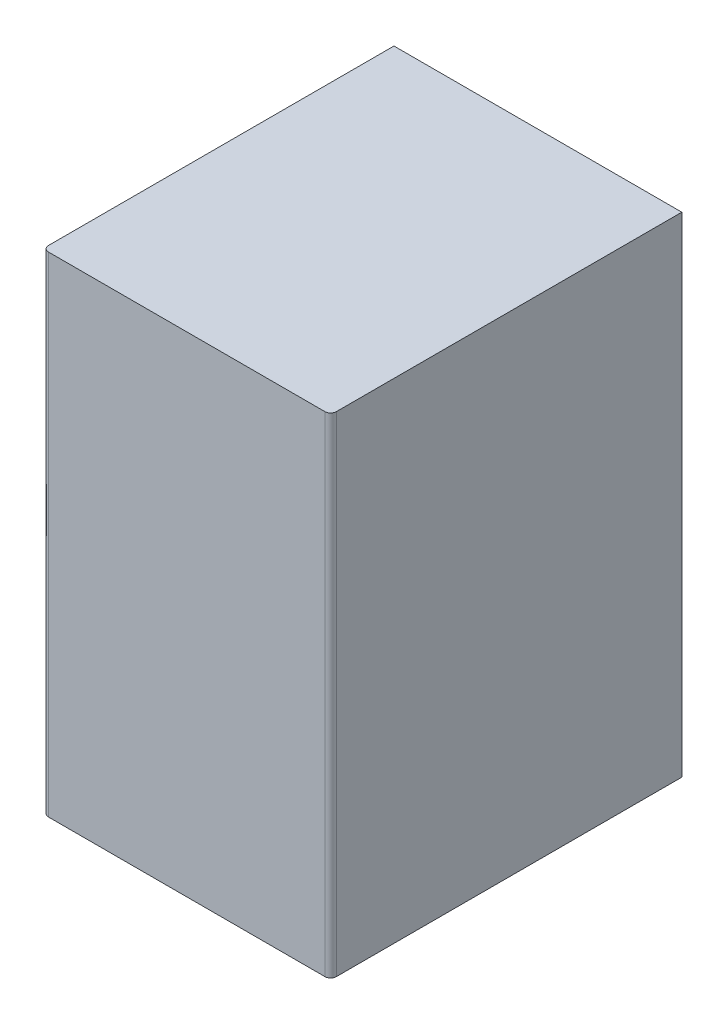
ISO-10303-21;
HEADER;
FILE_DESCRIPTION(('STEP AP214'),'2;1');
FILE_NAME('part.step','',(''),(''),'','','');
FILE_SCHEMA(('AUTOMOTIVE_DESIGN { 1 0 10303 214 1 1 1 1 }'));
ENDSEC;
DATA;
#1=APPLICATION_CONTEXT('core data for automotive mechanical design processes');
#2=APPLICATION_PROTOCOL_DEFINITION('international standard','automotive_design',2000,#1);
#3=PRODUCT_CONTEXT('',#1,'mechanical');
#4=PRODUCT('Part','Part','',(#3));
#5=PRODUCT_RELATED_PRODUCT_CATEGORY('part','',(#4));
#6=PRODUCT_DEFINITION_FORMATION('','',#4);
#7=PRODUCT_DEFINITION_CONTEXT('part definition',#1,'design');
#8=PRODUCT_DEFINITION('design','',#6,#7);
#9=PRODUCT_DEFINITION_SHAPE('','',#8);
#10=(LENGTH_UNIT() NAMED_UNIT(*) SI_UNIT(.MILLI.,.METRE.));
#11=(NAMED_UNIT(*) PLANE_ANGLE_UNIT() SI_UNIT($,.RADIAN.));
#12=(NAMED_UNIT(*) SI_UNIT($,.STERADIAN.) SOLID_ANGLE_UNIT());
#13=UNCERTAINTY_MEASURE_WITH_UNIT(LENGTH_MEASURE(1.E-05),#10,'distance_accuracy_value','');
#14=(GEOMETRIC_REPRESENTATION_CONTEXT(3) GLOBAL_UNCERTAINTY_ASSIGNED_CONTEXT((#13)) GLOBAL_UNIT_ASSIGNED_CONTEXT((#10,
#11,#12)) REPRESENTATION_CONTEXT('',''));
#15=CARTESIAN_POINT('',(0.,0.,0.));
#16=DIRECTION('',(0.,0.,1.));
#17=DIRECTION('',(1.,0.,0.));
#18=AXIS2_PLACEMENT_3D('',#15,#16,#17);
#19=CARTESIAN_POINT('',(250.,850.,-305.));
#20=DIRECTION('',(-1.,0.,0.));
#21=DIRECTION('',(0.,0.,1.));
#22=AXIS2_PLACEMENT_3D('',#19,#20,#21);
#23=PLANE('',#22);
#24=DIRECTION('',(0.,0.,-1.));
#25=VECTOR('',#24,1.);
#26=CARTESIAN_POINT('',(250.,850.,-305.));
#27=LINE('',#26,#25);
#28=CARTESIAN_POINT('',(250.,850.,295.));
#29=VERTEX_POINT('',#28);
#30=CARTESIAN_POINT('',(250.,850.,-305.));
#31=VERTEX_POINT('',#30);
#32=EDGE_CURVE('E93',#29,#31,#27,.T.);
#33=ORIENTED_EDGE('',*,*,#32,.F.);
#34=DIRECTION('',(0.,-1.,0.));
#35=VECTOR('',#34,1.);
#36=CARTESIAN_POINT('',(250.,850.,295.));
#37=LINE('',#36,#35);
#38=CARTESIAN_POINT('',(250.,0.,295.));
#39=VERTEX_POINT('',#38);
#40=EDGE_CURVE('E11',#29,#39,#37,.T.);
#41=ORIENTED_EDGE('',*,*,#40,.T.);
#42=DIRECTION('',(0.,0.,-1.));
#43=VECTOR('',#42,1.);
#44=CARTESIAN_POINT('',(250.,0.,-305.));
#45=LINE('',#44,#43);
#46=CARTESIAN_POINT('',(250.,0.,-305.));
#47=VERTEX_POINT('',#46);
#48=EDGE_CURVE('E114',#39,#47,#45,.T.);
#49=ORIENTED_EDGE('',*,*,#48,.T.);
#50=DIRECTION('',(0.,-1.,0.));
#51=VECTOR('',#50,1.);
#52=CARTESIAN_POINT('',(250.,850.,-305.));
#53=LINE('',#52,#51);
#54=EDGE_CURVE('E107',#31,#47,#53,.T.);
#55=ORIENTED_EDGE('',*,*,#54,.F.);
#56=EDGE_LOOP('',(#33,#41,#49,#55));
#57=FACE_BOUND('',#56,.T.);
#58=ADVANCED_FACE('F39',(#57),#23,.F.);
#59=CARTESIAN_POINT('',(-250.,850.,-305.));
#60=DIRECTION('',(0.,0.,1.));
#61=DIRECTION('',(1.,0.,0.));
#62=AXIS2_PLACEMENT_3D('',#59,#60,#61);
#63=PLANE('',#62);
#64=DIRECTION('',(-1.,0.,0.));
#65=VECTOR('',#64,1.);
#66=CARTESIAN_POINT('',(-250.,0.,-305.));
#67=LINE('',#66,#65);
#68=CARTESIAN_POINT('',(-250.,0.,-305.));
#69=VERTEX_POINT('',#68);
#70=EDGE_CURVE('E158',#47,#69,#67,.T.);
#71=ORIENTED_EDGE('',*,*,#70,.T.);
#72=DIRECTION('',(0.,-1.,0.));
#73=VECTOR('',#72,1.);
#74=CARTESIAN_POINT('',(-250.,850.,-305.));
#75=LINE('',#74,#73);
#76=CARTESIAN_POINT('',(-250.,850.,-305.));
#77=VERTEX_POINT('',#76);
#78=EDGE_CURVE('E109',#77,#69,#75,.T.);
#79=ORIENTED_EDGE('',*,*,#78,.F.);
#80=DIRECTION('',(-1.,0.,0.));
#81=VECTOR('',#80,1.);
#82=CARTESIAN_POINT('',(-250.,850.,-305.));
#83=LINE('',#82,#81);
#84=EDGE_CURVE('E96',#31,#77,#83,.T.);
#85=ORIENTED_EDGE('',*,*,#84,.F.);
#86=ORIENTED_EDGE('',*,*,#54,.T.);
#87=EDGE_LOOP('',(#71,#79,#85,#86));
#88=FACE_BOUND('',#87,.T.);
#89=ADVANCED_FACE('F106',(#88),#63,.F.);
#90=CARTESIAN_POINT('',(-250.,850.,-305.));
#91=DIRECTION('',(1.,0.,0.));
#92=DIRECTION('',(0.,0.,-1.));
#93=AXIS2_PLACEMENT_3D('',#90,#91,#92);
#94=PLANE('',#93);
#95=DIRECTION('',(0.,0.,1.));
#96=VECTOR('',#95,1.);
#97=CARTESIAN_POINT('',(-250.,0.,-305.));
#98=LINE('',#97,#96);
#99=CARTESIAN_POINT('',(-250.,0.,295.));
#100=VERTEX_POINT('',#99);
#101=EDGE_CURVE('E155',#69,#100,#98,.T.);
#102=ORIENTED_EDGE('',*,*,#101,.T.);
#103=DIRECTION('',(0.,-1.,0.));
#104=VECTOR('',#103,1.);
#105=CARTESIAN_POINT('',(-250.,850.,295.));
#106=LINE('',#105,#104);
#107=CARTESIAN_POINT('',(-250.,850.,295.));
#108=VERTEX_POINT('',#107);
#109=EDGE_CURVE('E63',#100,#108,#106,.F.);
#110=ORIENTED_EDGE('',*,*,#109,.T.);
#111=DIRECTION('',(0.,0.,1.));
#112=VECTOR('',#111,1.);
#113=CARTESIAN_POINT('',(-250.,850.,-305.));
#114=LINE('',#113,#112);
#115=EDGE_CURVE('E111',#77,#108,#114,.T.);
#116=ORIENTED_EDGE('',*,*,#115,.F.);
#117=ORIENTED_EDGE('',*,*,#78,.T.);
#118=EDGE_LOOP('',(#102,#110,#116,#117));
#119=FACE_BOUND('',#118,.T.);
#120=ADVANCED_FACE('F156',(#119),#94,.F.);
#121=CARTESIAN_POINT('',(-250.,850.,305.));
#122=DIRECTION('',(0.,0.,-1.));
#123=DIRECTION('',(-1.,0.,0.));
#124=AXIS2_PLACEMENT_3D('',#121,#122,#123);
#125=PLANE('',#124);
#126=DIRECTION('',(1.,0.,0.));
#127=VECTOR('',#126,1.);
#128=CARTESIAN_POINT('',(-250.,850.,305.));
#129=LINE('',#128,#127);
#130=CARTESIAN_POINT('',(-240.,850.,305.));
#131=VERTEX_POINT('',#130);
#132=CARTESIAN_POINT('',(240.,850.,305.));
#133=VERTEX_POINT('',#132);
#134=EDGE_CURVE('E123',#131,#133,#129,.T.);
#135=ORIENTED_EDGE('',*,*,#134,.F.);
#136=DIRECTION('',(0.,-1.,0.));
#137=VECTOR('',#136,1.);
#138=CARTESIAN_POINT('',(-240.,850.,305.));
#139=LINE('',#138,#137);
#140=CARTESIAN_POINT('',(-240.,0.,305.));
#141=VERTEX_POINT('',#140);
#142=EDGE_CURVE('E121',#131,#141,#139,.T.);
#143=ORIENTED_EDGE('',*,*,#142,.T.);
#144=DIRECTION('',(1.,0.,0.));
#145=VECTOR('',#144,1.);
#146=CARTESIAN_POINT('',(-250.,0.,305.));
#147=LINE('',#146,#145);
#148=CARTESIAN_POINT('',(240.,0.,305.));
#149=VERTEX_POINT('',#148);
#150=EDGE_CURVE('E102',#141,#149,#147,.T.);
#151=ORIENTED_EDGE('',*,*,#150,.T.);
#152=DIRECTION('',(0.,-1.,0.));
#153=VECTOR('',#152,1.);
#154=CARTESIAN_POINT('',(240.,850.,305.));
#155=LINE('',#154,#153);
#156=EDGE_CURVE('E117',#149,#133,#155,.F.);
#157=ORIENTED_EDGE('',*,*,#156,.T.);
#158=EDGE_LOOP('',(#135,#143,#151,#157));
#159=FACE_BOUND('',#158,.T.);
#160=ADVANCED_FACE('F145',(#159),#125,.F.);
#161=CARTESIAN_POINT('',(0.,850.,0.));
#162=DIRECTION('',(0.,1.,0.));
#163=DIRECTION('',(0.,0.,1.));
#164=AXIS2_PLACEMENT_3D('',#161,#162,#163);
#165=PLANE('',#164);
#166=ORIENTED_EDGE('',*,*,#115,.T.);
#167=CARTESIAN_POINT('',(-240.,850.,295.));
#168=DIRECTION('',(0.,1.,0.));
#169=DIRECTION('',(0.,0.,1.));
#170=AXIS2_PLACEMENT_3D('',#167,#168,#169);
#171=CIRCLE('',#170,10.);
#172=EDGE_CURVE('E48',#108,#131,#171,.T.);
#173=ORIENTED_EDGE('',*,*,#172,.T.);
#174=ORIENTED_EDGE('',*,*,#134,.T.);
#175=CARTESIAN_POINT('',(240.,850.,295.));
#176=DIRECTION('',(0.,1.,0.));
#177=DIRECTION('',(0.,0.,1.));
#178=AXIS2_PLACEMENT_3D('',#175,#176,#177);
#179=CIRCLE('',#178,10.);
#180=EDGE_CURVE('E55',#133,#29,#179,.T.);
#181=ORIENTED_EDGE('',*,*,#180,.T.);
#182=ORIENTED_EDGE('',*,*,#32,.T.);
#183=ORIENTED_EDGE('',*,*,#84,.T.);
#184=EDGE_LOOP('',(#166,#173,#174,#181,#182,#183));
#185=FACE_BOUND('',#184,.T.);
#186=ADVANCED_FACE('F95',(#185),#165,.T.);
#187=CARTESIAN_POINT('',(0.,0.,0.));
#188=DIRECTION('',(0.,1.,0.));
#189=DIRECTION('',(0.,0.,1.));
#190=AXIS2_PLACEMENT_3D('',#187,#188,#189);
#191=PLANE('',#190);
#192=ORIENTED_EDGE('',*,*,#150,.F.);
#193=CARTESIAN_POINT('',(-240.,0.,295.));
#194=DIRECTION('',(0.,1.,0.));
#195=DIRECTION('',(0.,0.,1.));
#196=AXIS2_PLACEMENT_3D('',#193,#194,#195);
#197=CIRCLE('',#196,10.);
#198=EDGE_CURVE('E133',#141,#100,#197,.F.);
#199=ORIENTED_EDGE('',*,*,#198,.T.);
#200=ORIENTED_EDGE('',*,*,#101,.F.);
#201=ORIENTED_EDGE('',*,*,#70,.F.);
#202=ORIENTED_EDGE('',*,*,#48,.F.);
#203=CARTESIAN_POINT('',(240.,0.,295.));
#204=DIRECTION('',(0.,1.,0.));
#205=DIRECTION('',(0.,0.,1.));
#206=AXIS2_PLACEMENT_3D('',#203,#204,#205);
#207=CIRCLE('',#206,10.);
#208=EDGE_CURVE('E130',#39,#149,#207,.F.);
#209=ORIENTED_EDGE('',*,*,#208,.T.);
#210=EDGE_LOOP('',(#192,#199,#200,#201,#202,#209));
#211=FACE_BOUND('',#210,.T.);
#212=ADVANCED_FACE('F154',(#211),#191,.F.);
#213=CARTESIAN_POINT('',(-240.,850.,295.));
#214=DIRECTION('',(0.,-1.,0.));
#215=DIRECTION('',(0.,0.,-1.));
#216=AXIS2_PLACEMENT_3D('',#213,#214,#215);
#217=CYLINDRICAL_SURFACE('',#216,10.);
#218=ORIENTED_EDGE('',*,*,#172,.F.);
#219=ORIENTED_EDGE('',*,*,#109,.F.);
#220=ORIENTED_EDGE('',*,*,#198,.F.);
#221=ORIENTED_EDGE('',*,*,#142,.F.);
#222=EDGE_LOOP('',(#218,#219,#220,#221));
#223=FACE_BOUND('',#222,.T.);
#224=ADVANCED_FACE('F151',(#223),#217,.T.);
#225=CARTESIAN_POINT('',(240.,850.,295.));
#226=DIRECTION('',(0.,-1.,0.));
#227=DIRECTION('',(0.,0.,-1.));
#228=AXIS2_PLACEMENT_3D('',#225,#226,#227);
#229=CYLINDRICAL_SURFACE('',#228,10.);
#230=ORIENTED_EDGE('',*,*,#180,.F.);
#231=ORIENTED_EDGE('',*,*,#156,.F.);
#232=ORIENTED_EDGE('',*,*,#208,.F.);
#233=ORIENTED_EDGE('',*,*,#40,.F.);
#234=EDGE_LOOP('',(#230,#231,#232,#233));
#235=FACE_BOUND('',#234,.T.);
#236=ADVANCED_FACE('F41',(#235),#229,.T.);
#237=CLOSED_SHELL('',(#58,#89,#120,#160,#186,#212,#224,#236));
#238=MANIFOLD_SOLID_BREP('B2',#237);
#239=ADVANCED_BREP_SHAPE_REPRESENTATION('',(#18,#238),#14);
#240=SHAPE_DEFINITION_REPRESENTATION(#9,#239);
ENDSEC;
END-ISO-10303-21;
